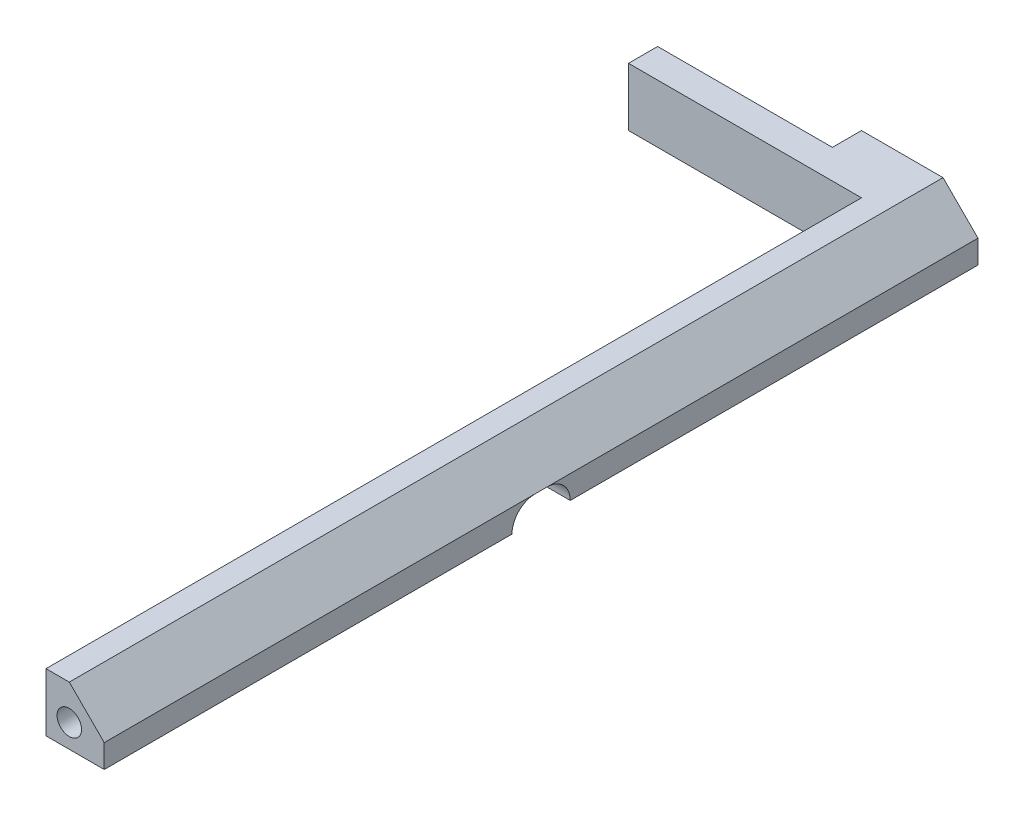
ISO-10303-21;
HEADER;
FILE_DESCRIPTION(('STEP AP214'),'2;1');
FILE_NAME('part.step','',(''),(''),'','','');
FILE_SCHEMA(('AUTOMOTIVE_DESIGN { 1 0 10303 214 1 1 1 1 }'));
ENDSEC;
DATA;
#1=APPLICATION_CONTEXT('core data for automotive mechanical design processes');
#2=APPLICATION_PROTOCOL_DEFINITION('international standard','automotive_design',2000,#1);
#3=PRODUCT_CONTEXT('',#1,'mechanical');
#4=PRODUCT('Part','Part','',(#3));
#5=PRODUCT_RELATED_PRODUCT_CATEGORY('part','',(#4));
#6=PRODUCT_DEFINITION_FORMATION('','',#4);
#7=PRODUCT_DEFINITION_CONTEXT('part definition',#1,'design');
#8=PRODUCT_DEFINITION('design','',#6,#7);
#9=PRODUCT_DEFINITION_SHAPE('','',#8);
#10=(LENGTH_UNIT() NAMED_UNIT(*) SI_UNIT(.MILLI.,.METRE.));
#11=(NAMED_UNIT(*) PLANE_ANGLE_UNIT() SI_UNIT($,.RADIAN.));
#12=(NAMED_UNIT(*) SI_UNIT($,.STERADIAN.) SOLID_ANGLE_UNIT());
#13=UNCERTAINTY_MEASURE_WITH_UNIT(LENGTH_MEASURE(1.E-05),#10,'distance_accuracy_value','');
#14=(GEOMETRIC_REPRESENTATION_CONTEXT(3) GLOBAL_UNCERTAINTY_ASSIGNED_CONTEXT((#13)) GLOBAL_UNIT_ASSIGNED_CONTEXT((#10,
#11,#12)) REPRESENTATION_CONTEXT('',''));
#15=CARTESIAN_POINT('',(0.,0.,0.));
#16=DIRECTION('',(0.,0.,1.));
#17=DIRECTION('',(1.,0.,0.));
#18=AXIS2_PLACEMENT_3D('',#15,#16,#17);
#19=CARTESIAN_POINT('',(0.,10.,0.));
#20=DIRECTION('',(-1.,0.,0.));
#21=DIRECTION('',(0.,0.,1.));
#22=AXIS2_PLACEMENT_3D('',#19,#20,#21);
#23=PLANE('',#22);
#24=DIRECTION('',(0.,0.,-1.));
#25=VECTOR('',#24,1.);
#26=CARTESIAN_POINT('',(0.,0.,0.));
#27=LINE('',#26,#25);
#28=CARTESIAN_POINT('',(0.,0.,0.));
#29=VERTEX_POINT('',#28);
#30=CARTESIAN_POINT('',(0.,0.,-70.));
#31=VERTEX_POINT('',#30);
#32=EDGE_CURVE('E226',#29,#31,#27,.T.);
#33=ORIENTED_EDGE('',*,*,#32,.T.);
#34=CARTESIAN_POINT('',(0.,0.,-74.));
#35=DIRECTION('',(-1.,0.,0.));
#36=DIRECTION('',(0.,0.,1.));
#37=AXIS2_PLACEMENT_3D('',#34,#35,#36);
#38=CIRCLE('',#37,4.);
#39=CARTESIAN_POINT('',(0.,4.,-74.));
#40=VERTEX_POINT('',#39);
#41=EDGE_CURVE('E11',#31,#40,#38,.T.);
#42=ORIENTED_EDGE('',*,*,#41,.T.);
#43=DIRECTION('',(0.,0.,1.));
#44=VECTOR('',#43,1.);
#45=CARTESIAN_POINT('',(0.,3.99999999999998,0.));
#46=LINE('',#45,#44);
#47=CARTESIAN_POINT('',(0.,3.99999999999998,0.));
#48=VERTEX_POINT('',#47);
#49=EDGE_CURVE('E59',#40,#48,#46,.T.);
#50=ORIENTED_EDGE('',*,*,#49,.T.);
#51=DIRECTION('',(0.,-1.,0.));
#52=VECTOR('',#51,1.);
#53=CARTESIAN_POINT('',(0.,10.,0.));
#54=LINE('',#53,#52);
#55=EDGE_CURVE('E271',#48,#29,#54,.T.);
#56=ORIENTED_EDGE('',*,*,#55,.T.);
#57=EDGE_LOOP('',(#33,#42,#50,#56));
#58=FACE_BOUND('',#57,.T.);
#59=ADVANCED_FACE('F43',(#58),#23,.F.);
#60=CARTESIAN_POINT('',(0.,0.,0.));
#61=DIRECTION('',(0.,1.,0.));
#62=DIRECTION('',(0.,0.,1.));
#63=AXIS2_PLACEMENT_3D('',#60,#61,#62);
#64=PLANE('',#63);
#65=CARTESIAN_POINT('',(-7.2,0.,-27.));
#66=DIRECTION('',(0.,-1.,0.));
#67=DIRECTION('',(0.,0.,-1.));
#68=AXIS2_PLACEMENT_3D('',#65,#66,#67);
#69=CIRCLE('',#68,2.1);
#70=CARTESIAN_POINT('',(-7.2,0.,-29.1));
#71=VERTEX_POINT('',#70);
#72=EDGE_CURVE('E180',#71,#71,#69,.T.);
#73=ORIENTED_EDGE('',*,*,#72,.F.);
#74=EDGE_LOOP('',(#73));
#75=FACE_BOUND('',#74,.T.);
#76=DIRECTION('',(0.,0.,1.));
#77=VECTOR('',#76,1.);
#78=CARTESIAN_POINT('',(-10.,0.,-140.));
#79=LINE('',#78,#77);
#80=CARTESIAN_POINT('',(-10.,0.,-70.));
#81=VERTEX_POINT('',#80);
#82=CARTESIAN_POINT('',(-10.,0.,0.));
#83=VERTEX_POINT('',#82);
#84=EDGE_CURVE('E143',#81,#83,#79,.T.);
#85=ORIENTED_EDGE('',*,*,#84,.F.);
#86=DIRECTION('',(-1.,0.,0.));
#87=VECTOR('',#86,1.);
#88=CARTESIAN_POINT('',(0.,0.,-70.));
#89=LINE('',#88,#87);
#90=EDGE_CURVE('E157',#31,#81,#89,.T.);
#91=ORIENTED_EDGE('',*,*,#90,.F.);
#92=ORIENTED_EDGE('',*,*,#32,.F.);
#93=DIRECTION('',(1.,0.,0.));
#94=VECTOR('',#93,1.);
#95=CARTESIAN_POINT('',(-10.,0.,0.));
#96=LINE('',#95,#94);
#97=EDGE_CURVE('E160',#83,#29,#96,.T.);
#98=ORIENTED_EDGE('',*,*,#97,.F.);
#99=EDGE_LOOP('',(#85,#91,#92,#98));
#100=FACE_BOUND('',#99,.T.);
#101=ADVANCED_FACE('F155',(#75,#100),#64,.F.);
#102=CARTESIAN_POINT('',(-10.,10.,0.));
#103=DIRECTION('',(0.,0.,-1.));
#104=DIRECTION('',(-1.,0.,0.));
#105=AXIS2_PLACEMENT_3D('',#102,#103,#104);
#106=PLANE('',#105);
#107=CARTESIAN_POINT('',(-6.,4.,0.));
#108=DIRECTION('',(0.,0.,1.));
#109=DIRECTION('',(1.,0.,0.));
#110=AXIS2_PLACEMENT_3D('',#107,#108,#109);
#111=CIRCLE('',#110,2.1);
#112=CARTESIAN_POINT('',(-3.9,4.,0.));
#113=VERTEX_POINT('',#112);
#114=EDGE_CURVE('E181',#113,#113,#111,.T.);
#115=ORIENTED_EDGE('',*,*,#114,.F.);
#116=EDGE_LOOP('',(#115));
#117=FACE_BOUND('',#116,.T.);
#118=ORIENTED_EDGE('',*,*,#55,.F.);
#119=DIRECTION('',(-0.707106781186546,0.707106781186549,0.));
#120=VECTOR('',#119,1.);
#121=CARTESIAN_POINT('',(-5.99999999999999,10.,0.));
#122=LINE('',#121,#120);
#123=CARTESIAN_POINT('',(-5.99999999999999,10.,0.));
#124=VERTEX_POINT('',#123);
#125=EDGE_CURVE('E283',#48,#124,#122,.T.);
#126=ORIENTED_EDGE('',*,*,#125,.T.);
#127=DIRECTION('',(1.,0.,0.));
#128=VECTOR('',#127,1.);
#129=CARTESIAN_POINT('',(-10.,10.,0.));
#130=LINE('',#129,#128);
#131=CARTESIAN_POINT('',(-10.,10.,0.));
#132=VERTEX_POINT('',#131);
#133=EDGE_CURVE('E200',#132,#124,#130,.T.);
#134=ORIENTED_EDGE('',*,*,#133,.F.);
#135=DIRECTION('',(0.,-1.,0.));
#136=VECTOR('',#135,1.);
#137=CARTESIAN_POINT('',(-10.,10.,0.));
#138=LINE('',#137,#136);
#139=EDGE_CURVE('E222',#132,#83,#138,.T.);
#140=ORIENTED_EDGE('',*,*,#139,.T.);
#141=ORIENTED_EDGE('',*,*,#97,.T.);
#142=EDGE_LOOP('',(#118,#126,#134,#140,#141));
#143=FACE_BOUND('',#142,.T.);
#144=ADVANCED_FACE('F316',(#117,#143),#106,.F.);
#145=CARTESIAN_POINT('',(0.,3.99999999999998,-150.));
#146=VERTEX_POINT('',#145);
#147=CARTESIAN_POINT('',(0.,3.99999999999998,-76.));
#148=VERTEX_POINT('',#147);
#149=EDGE_CURVE('E67',#146,#148,#46,.T.);
#150=ORIENTED_EDGE('',*,*,#149,.T.);
#151=CARTESIAN_POINT('',(0.,0.,-76.));
#152=DIRECTION('',(-1.,0.,0.));
#153=DIRECTION('',(0.,0.,1.));
#154=AXIS2_PLACEMENT_3D('',#151,#152,#153);
#155=CIRCLE('',#154,4.);
#156=CARTESIAN_POINT('',(0.,0.,-80.));
#157=VERTEX_POINT('',#156);
#158=EDGE_CURVE('E293',#148,#157,#155,.T.);
#159=ORIENTED_EDGE('',*,*,#158,.T.);
#160=CARTESIAN_POINT('',(0.,0.,-150.));
#161=VERTEX_POINT('',#160);
#162=EDGE_CURVE('E225',#157,#161,#27,.T.);
#163=ORIENTED_EDGE('',*,*,#162,.T.);
#164=DIRECTION('',(0.,-1.,0.));
#165=VECTOR('',#164,1.);
#166=CARTESIAN_POINT('',(0.,10.,-150.));
#167=LINE('',#166,#165);
#168=EDGE_CURVE('E267',#146,#161,#167,.T.);
#169=ORIENTED_EDGE('',*,*,#168,.F.);
#170=EDGE_LOOP('',(#150,#159,#163,#169));
#171=FACE_BOUND('',#170,.T.);
#172=ADVANCED_FACE('F306',(#171),#23,.F.);
#173=CARTESIAN_POINT('',(0.,10.,-150.));
#174=DIRECTION('',(0.,0.,1.));
#175=DIRECTION('',(1.,0.,0.));
#176=AXIS2_PLACEMENT_3D('',#173,#174,#175);
#177=PLANE('',#176);
#178=DIRECTION('',(-1.,0.,0.));
#179=VECTOR('',#178,1.);
#180=CARTESIAN_POINT('',(0.,10.,-150.));
#181=LINE('',#180,#179);
#182=CARTESIAN_POINT('',(-5.99999999999999,10.,-150.));
#183=VERTEX_POINT('',#182);
#184=CARTESIAN_POINT('',(-20.,10.,-150.));
#185=VERTEX_POINT('',#184);
#186=EDGE_CURVE('E204',#183,#185,#181,.T.);
#187=ORIENTED_EDGE('',*,*,#186,.F.);
#188=DIRECTION('',(0.707106781186546,-0.707106781186549,0.));
#189=VECTOR('',#188,1.);
#190=CARTESIAN_POINT('',(-5.99999999999999,10.,-150.));
#191=LINE('',#190,#189);
#192=EDGE_CURVE('E278',#183,#146,#191,.T.);
#193=ORIENTED_EDGE('',*,*,#192,.T.);
#194=ORIENTED_EDGE('',*,*,#168,.T.);
#195=DIRECTION('',(-1.,0.,0.));
#196=VECTOR('',#195,1.);
#197=CARTESIAN_POINT('',(0.,0.,-150.));
#198=LINE('',#197,#196);
#199=CARTESIAN_POINT('',(-20.,0.,-150.));
#200=VERTEX_POINT('',#199);
#201=EDGE_CURVE('E229',#161,#200,#198,.T.);
#202=ORIENTED_EDGE('',*,*,#201,.T.);
#203=DIRECTION('',(0.,-1.,0.));
#204=VECTOR('',#203,1.);
#205=CARTESIAN_POINT('',(-20.,10.,-150.));
#206=LINE('',#205,#204);
#207=EDGE_CURVE('E263',#185,#200,#206,.T.);
#208=ORIENTED_EDGE('',*,*,#207,.F.);
#209=EDGE_LOOP('',(#187,#193,#194,#202,#208));
#210=FACE_BOUND('',#209,.T.);
#211=ADVANCED_FACE('F344',(#210),#177,.F.);
#212=CARTESIAN_POINT('',(-20.,10.,-150.));
#213=DIRECTION('',(1.,0.,0.));
#214=DIRECTION('',(0.,0.,-1.));
#215=AXIS2_PLACEMENT_3D('',#212,#213,#214);
#216=PLANE('',#215);
#217=DIRECTION('',(0.,0.,1.));
#218=VECTOR('',#217,1.);
#219=CARTESIAN_POINT('',(-20.,0.,-150.));
#220=LINE('',#219,#218);
#221=CARTESIAN_POINT('',(-20.,0.,-145.));
#222=VERTEX_POINT('',#221);
#223=EDGE_CURVE('E232',#200,#222,#220,.T.);
#224=ORIENTED_EDGE('',*,*,#223,.T.);
#225=DIRECTION('',(0.,-1.,0.));
#226=VECTOR('',#225,1.);
#227=CARTESIAN_POINT('',(-20.,10.,-145.));
#228=LINE('',#227,#226);
#229=CARTESIAN_POINT('',(-20.,10.,-145.));
#230=VERTEX_POINT('',#229);
#231=EDGE_CURVE('E259',#230,#222,#228,.T.);
#232=ORIENTED_EDGE('',*,*,#231,.F.);
#233=DIRECTION('',(0.,0.,1.));
#234=VECTOR('',#233,1.);
#235=CARTESIAN_POINT('',(-20.,10.,-150.));
#236=LINE('',#235,#234);
#237=EDGE_CURVE('E207',#185,#230,#236,.T.);
#238=ORIENTED_EDGE('',*,*,#237,.F.);
#239=ORIENTED_EDGE('',*,*,#207,.T.);
#240=EDGE_LOOP('',(#224,#232,#238,#239));
#241=FACE_BOUND('',#240,.T.);
#242=ADVANCED_FACE('F340',(#241),#216,.F.);
#243=CARTESIAN_POINT('',(-50.,10.,-145.));
#244=DIRECTION('',(0.,0.,1.));
#245=DIRECTION('',(1.,0.,0.));
#246=AXIS2_PLACEMENT_3D('',#243,#244,#245);
#247=PLANE('',#246);
#248=DIRECTION('',(-1.,0.,0.));
#249=VECTOR('',#248,1.);
#250=CARTESIAN_POINT('',(-50.,0.,-145.));
#251=LINE('',#250,#249);
#252=CARTESIAN_POINT('',(-50.,0.,-145.));
#253=VERTEX_POINT('',#252);
#254=EDGE_CURVE('E235',#222,#253,#251,.T.);
#255=ORIENTED_EDGE('',*,*,#254,.T.);
#256=DIRECTION('',(0.,-1.,0.));
#257=VECTOR('',#256,1.);
#258=CARTESIAN_POINT('',(-50.,10.,-145.));
#259=LINE('',#258,#257);
#260=CARTESIAN_POINT('',(-50.,10.,-145.));
#261=VERTEX_POINT('',#260);
#262=EDGE_CURVE('E255',#261,#253,#259,.T.);
#263=ORIENTED_EDGE('',*,*,#262,.F.);
#264=DIRECTION('',(-1.,0.,0.));
#265=VECTOR('',#264,1.);
#266=CARTESIAN_POINT('',(-50.,10.,-145.));
#267=LINE('',#266,#265);
#268=EDGE_CURVE('E210',#230,#261,#267,.T.);
#269=ORIENTED_EDGE('',*,*,#268,.F.);
#270=ORIENTED_EDGE('',*,*,#231,.T.);
#271=EDGE_LOOP('',(#255,#263,#269,#270));
#272=FACE_BOUND('',#271,.T.);
#273=ADVANCED_FACE('F336',(#272),#247,.F.);
#274=CARTESIAN_POINT('',(-50.,10.,-140.));
#275=DIRECTION('',(1.,0.,0.));
#276=DIRECTION('',(0.,0.,-1.));
#277=AXIS2_PLACEMENT_3D('',#274,#275,#276);
#278=PLANE('',#277);
#279=DIRECTION('',(0.,0.,1.));
#280=VECTOR('',#279,1.);
#281=CARTESIAN_POINT('',(-50.,0.,-140.));
#282=LINE('',#281,#280);
#283=CARTESIAN_POINT('',(-50.,0.,-140.));
#284=VERTEX_POINT('',#283);
#285=EDGE_CURVE('E238',#253,#284,#282,.T.);
#286=ORIENTED_EDGE('',*,*,#285,.T.);
#287=DIRECTION('',(0.,-1.,0.));
#288=VECTOR('',#287,1.);
#289=CARTESIAN_POINT('',(-50.,10.,-140.));
#290=LINE('',#289,#288);
#291=CARTESIAN_POINT('',(-50.,10.,-140.));
#292=VERTEX_POINT('',#291);
#293=EDGE_CURVE('E251',#292,#284,#290,.T.);
#294=ORIENTED_EDGE('',*,*,#293,.F.);
#295=DIRECTION('',(0.,0.,1.));
#296=VECTOR('',#295,1.);
#297=CARTESIAN_POINT('',(-50.,10.,-140.));
#298=LINE('',#297,#296);
#299=EDGE_CURVE('E213',#261,#292,#298,.T.);
#300=ORIENTED_EDGE('',*,*,#299,.F.);
#301=ORIENTED_EDGE('',*,*,#262,.T.);
#302=EDGE_LOOP('',(#286,#294,#300,#301));
#303=FACE_BOUND('',#302,.T.);
#304=ADVANCED_FACE('F332',(#303),#278,.F.);
#305=CARTESIAN_POINT('',(-50.,10.,-140.));
#306=DIRECTION('',(0.,0.,-1.));
#307=DIRECTION('',(-1.,0.,0.));
#308=AXIS2_PLACEMENT_3D('',#305,#306,#307);
#309=PLANE('',#308);
#310=DIRECTION('',(1.,0.,0.));
#311=VECTOR('',#310,1.);
#312=CARTESIAN_POINT('',(-50.,0.,-140.));
#313=LINE('',#312,#311);
#314=CARTESIAN_POINT('',(-10.,0.,-140.));
#315=VERTEX_POINT('',#314);
#316=EDGE_CURVE('E163',#284,#315,#313,.T.);
#317=ORIENTED_EDGE('',*,*,#316,.T.);
#318=DIRECTION('',(0.,-1.,0.));
#319=VECTOR('',#318,1.);
#320=CARTESIAN_POINT('',(-10.,10.,-140.));
#321=LINE('',#320,#319);
#322=CARTESIAN_POINT('',(-10.,10.,-140.));
#323=VERTEX_POINT('',#322);
#324=EDGE_CURVE('E247',#323,#315,#321,.T.);
#325=ORIENTED_EDGE('',*,*,#324,.F.);
#326=DIRECTION('',(1.,0.,0.));
#327=VECTOR('',#326,1.);
#328=CARTESIAN_POINT('',(-50.,10.,-140.));
#329=LINE('',#328,#327);
#330=EDGE_CURVE('E216',#292,#323,#329,.T.);
#331=ORIENTED_EDGE('',*,*,#330,.F.);
#332=ORIENTED_EDGE('',*,*,#293,.T.);
#333=EDGE_LOOP('',(#317,#325,#331,#332));
#334=FACE_BOUND('',#333,.T.);
#335=ADVANCED_FACE('F327',(#334),#309,.F.);
#336=CARTESIAN_POINT('',(-10.,10.,-140.));
#337=DIRECTION('',(1.,0.,0.));
#338=DIRECTION('',(0.,0.,-1.));
#339=AXIS2_PLACEMENT_3D('',#336,#337,#338);
#340=PLANE('',#339);
#341=DIRECTION('',(0.,0.,-1.));
#342=VECTOR('',#341,1.);
#343=CARTESIAN_POINT('',(-10.,4.,-70.));
#344=LINE('',#343,#342);
#345=CARTESIAN_POINT('',(-10.,4.,-74.));
#346=VERTEX_POINT('',#345);
#347=CARTESIAN_POINT('',(-10.,4.,-76.));
#348=VERTEX_POINT('',#347);
#349=EDGE_CURVE('E146',#346,#348,#344,.T.);
#350=ORIENTED_EDGE('',*,*,#349,.F.);
#351=CARTESIAN_POINT('',(-10.,0.,-74.));
#352=DIRECTION('',(1.,0.,0.));
#353=DIRECTION('',(0.,0.,-1.));
#354=AXIS2_PLACEMENT_3D('',#351,#352,#353);
#355=CIRCLE('',#354,4.);
#356=EDGE_CURVE('E52',#346,#81,#355,.T.);
#357=ORIENTED_EDGE('',*,*,#356,.T.);
#358=ORIENTED_EDGE('',*,*,#84,.T.);
#359=ORIENTED_EDGE('',*,*,#139,.F.);
#360=DIRECTION('',(0.,0.,1.));
#361=VECTOR('',#360,1.);
#362=CARTESIAN_POINT('',(-10.,10.,-140.));
#363=LINE('',#362,#361);
#364=EDGE_CURVE('E219',#323,#132,#363,.T.);
#365=ORIENTED_EDGE('',*,*,#364,.F.);
#366=ORIENTED_EDGE('',*,*,#324,.T.);
#367=CARTESIAN_POINT('',(-10.,0.,-80.));
#368=VERTEX_POINT('',#367);
#369=EDGE_CURVE('E162',#315,#368,#79,.T.);
#370=ORIENTED_EDGE('',*,*,#369,.T.);
#371=CARTESIAN_POINT('',(-10.,0.,-76.));
#372=DIRECTION('',(1.,0.,0.));
#373=DIRECTION('',(0.,0.,-1.));
#374=AXIS2_PLACEMENT_3D('',#371,#372,#373);
#375=CIRCLE('',#374,4.);
#376=EDGE_CURVE('E152',#368,#348,#375,.T.);
#377=ORIENTED_EDGE('',*,*,#376,.T.);
#378=EDGE_LOOP('',(#350,#357,#358,#359,#365,#366,#370,#377));
#379=FACE_BOUND('',#378,.T.);
#380=ADVANCED_FACE('F141',(#379),#340,.F.);
#381=CARTESIAN_POINT('',(0.,10.,0.));
#382=DIRECTION('',(0.,1.,0.));
#383=DIRECTION('',(0.,0.,1.));
#384=AXIS2_PLACEMENT_3D('',#381,#382,#383);
#385=PLANE('',#384);
#386=ORIENTED_EDGE('',*,*,#133,.T.);
#387=DIRECTION('',(0.,0.,-1.));
#388=VECTOR('',#387,1.);
#389=CARTESIAN_POINT('',(-5.99999999999999,10.,-150.));
#390=LINE('',#389,#388);
#391=EDGE_CURVE('E274',#124,#183,#390,.T.);
#392=ORIENTED_EDGE('',*,*,#391,.T.);
#393=ORIENTED_EDGE('',*,*,#186,.T.);
#394=ORIENTED_EDGE('',*,*,#237,.T.);
#395=ORIENTED_EDGE('',*,*,#268,.T.);
#396=ORIENTED_EDGE('',*,*,#299,.T.);
#397=ORIENTED_EDGE('',*,*,#330,.T.);
#398=ORIENTED_EDGE('',*,*,#364,.T.);
#399=EDGE_LOOP('',(#386,#392,#393,#394,#395,#396,#397,#398));
#400=FACE_BOUND('',#399,.T.);
#401=ADVANCED_FACE('F321',(#400),#385,.T.);
#402=CARTESIAN_POINT('',(-7.19999999999998,0.,-123.));
#403=DIRECTION('',(0.,-1.,0.));
#404=DIRECTION('',(0.,0.,-1.));
#405=AXIS2_PLACEMENT_3D('',#402,#403,#404);
#406=CIRCLE('',#405,2.10000000000001);
#407=CARTESIAN_POINT('',(-7.19999999999998,0.,-125.1));
#408=VERTEX_POINT('',#407);
#409=EDGE_CURVE('E189',#408,#408,#406,.T.);
#410=ORIENTED_EDGE('',*,*,#409,.F.);
#411=EDGE_LOOP('',(#410));
#412=FACE_BOUND('',#411,.T.);
#413=ORIENTED_EDGE('',*,*,#162,.F.);
#414=DIRECTION('',(1.,0.,0.));
#415=VECTOR('',#414,1.);
#416=CARTESIAN_POINT('',(-10.,0.,-80.));
#417=LINE('',#416,#415);
#418=EDGE_CURVE('E167',#368,#157,#417,.T.);
#419=ORIENTED_EDGE('',*,*,#418,.F.);
#420=ORIENTED_EDGE('',*,*,#369,.F.);
#421=ORIENTED_EDGE('',*,*,#316,.F.);
#422=ORIENTED_EDGE('',*,*,#285,.F.);
#423=ORIENTED_EDGE('',*,*,#254,.F.);
#424=ORIENTED_EDGE('',*,*,#223,.F.);
#425=ORIENTED_EDGE('',*,*,#201,.F.);
#426=EDGE_LOOP('',(#413,#419,#420,#421,#422,#423,#424,#425));
#427=FACE_BOUND('',#426,.T.);
#428=ADVANCED_FACE('F309',(#412,#427),#64,.F.);
#429=CARTESIAN_POINT('',(-7.2,4.,-27.));
#430=DIRECTION('',(0.,-1.,0.));
#431=DIRECTION('',(0.,0.,-1.));
#432=AXIS2_PLACEMENT_3D('',#429,#430,#431);
#433=CYLINDRICAL_SURFACE('',#432,2.1);
#434=CARTESIAN_POINT('',(-7.2,4.,-27.));
#435=DIRECTION('',(0.,-1.,0.));
#436=DIRECTION('',(0.,0.,-1.));
#437=AXIS2_PLACEMENT_3D('',#434,#435,#436);
#438=CIRCLE('',#437,2.1);
#439=CARTESIAN_POINT('',(-7.2,4.,-29.1));
#440=VERTEX_POINT('',#439);
#441=EDGE_CURVE('E193',#440,#440,#438,.T.);
#442=ORIENTED_EDGE('',*,*,#441,.F.);
#443=EDGE_LOOP('',(#442));
#444=FACE_BOUND('',#443,.T.);
#445=ORIENTED_EDGE('',*,*,#72,.T.);
#446=EDGE_LOOP('',(#445));
#447=FACE_BOUND('',#446,.T.);
#448=ADVANCED_FACE('F395',(#444,#447),#433,.F.);
#449=CARTESIAN_POINT('',(-7.2,4.,-27.));
#450=DIRECTION('',(0.,-1.,0.));
#451=DIRECTION('',(0.,0.,-1.));
#452=AXIS2_PLACEMENT_3D('',#449,#450,#451);
#453=PLANE('',#452);
#454=ORIENTED_EDGE('',*,*,#441,.T.);
#455=EDGE_LOOP('',(#454));
#456=FACE_BOUND('',#455,.T.);
#457=ADVANCED_FACE('F391',(#456),#453,.T.);
#458=CARTESIAN_POINT('',(-7.19999999999998,4.,-123.));
#459=DIRECTION('',(0.,-1.,0.));
#460=DIRECTION('',(0.,0.,-1.));
#461=AXIS2_PLACEMENT_3D('',#458,#459,#460);
#462=CYLINDRICAL_SURFACE('',#461,2.10000000000001);
#463=CARTESIAN_POINT('',(-7.19999999999998,4.,-123.));
#464=DIRECTION('',(0.,-1.,0.));
#465=DIRECTION('',(0.,0.,-1.));
#466=AXIS2_PLACEMENT_3D('',#463,#464,#465);
#467=CIRCLE('',#466,2.10000000000001);
#468=CARTESIAN_POINT('',(-7.19999999999998,4.,-125.1));
#469=VERTEX_POINT('',#468);
#470=EDGE_CURVE('E185',#469,#469,#467,.T.);
#471=ORIENTED_EDGE('',*,*,#470,.F.);
#472=EDGE_LOOP('',(#471));
#473=FACE_BOUND('',#472,.T.);
#474=ORIENTED_EDGE('',*,*,#409,.T.);
#475=EDGE_LOOP('',(#474));
#476=FACE_BOUND('',#475,.T.);
#477=ADVANCED_FACE('F384',(#473,#476),#462,.F.);
#478=CARTESIAN_POINT('',(-7.19999999999998,4.,-123.));
#479=DIRECTION('',(0.,-1.,0.));
#480=DIRECTION('',(0.,0.,-1.));
#481=AXIS2_PLACEMENT_3D('',#478,#479,#480);
#482=PLANE('',#481);
#483=ORIENTED_EDGE('',*,*,#470,.T.);
#484=EDGE_LOOP('',(#483));
#485=FACE_BOUND('',#484,.T.);
#486=ADVANCED_FACE('F378',(#485),#482,.T.);
#487=CARTESIAN_POINT('',(-6.,4.,-4.));
#488=DIRECTION('',(0.,0.,1.));
#489=DIRECTION('',(1.,0.,0.));
#490=AXIS2_PLACEMENT_3D('',#487,#488,#489);
#491=CYLINDRICAL_SURFACE('',#490,2.1);
#492=CARTESIAN_POINT('',(-6.,4.,-4.));
#493=DIRECTION('',(0.,0.,1.));
#494=DIRECTION('',(1.,0.,0.));
#495=AXIS2_PLACEMENT_3D('',#492,#493,#494);
#496=CIRCLE('',#495,2.1);
#497=CARTESIAN_POINT('',(-3.9,4.,-4.));
#498=VERTEX_POINT('',#497);
#499=EDGE_CURVE('E176',#498,#498,#496,.T.);
#500=ORIENTED_EDGE('',*,*,#499,.F.);
#501=EDGE_LOOP('',(#500));
#502=FACE_BOUND('',#501,.T.);
#503=ORIENTED_EDGE('',*,*,#114,.T.);
#504=EDGE_LOOP('',(#503));
#505=FACE_BOUND('',#504,.T.);
#506=ADVANCED_FACE('F354',(#502,#505),#491,.F.);
#507=CARTESIAN_POINT('',(-6.,4.,-4.));
#508=DIRECTION('',(0.,0.,1.));
#509=DIRECTION('',(1.,0.,0.));
#510=AXIS2_PLACEMENT_3D('',#507,#508,#509);
#511=PLANE('',#510);
#512=ORIENTED_EDGE('',*,*,#499,.T.);
#513=EDGE_LOOP('',(#512));
#514=FACE_BOUND('',#513,.T.);
#515=ADVANCED_FACE('F347',(#514),#511,.T.);
#516=CARTESIAN_POINT('',(-5.99999999999999,10.,0.));
#517=DIRECTION('',(0.707106781186549,0.707106781186546,0.));
#518=DIRECTION('',(0.,0.,1.));
#519=AXIS2_PLACEMENT_3D('',#516,#517,#518);
#520=PLANE('',#519);
#521=ORIENTED_EDGE('',*,*,#125,.F.);
#522=ORIENTED_EDGE('',*,*,#49,.F.);
#523=DIRECTION('',(0.,0.,1.));
#524=VECTOR('',#523,1.);
#525=CARTESIAN_POINT('',(0.,4.,-80.));
#526=LINE('',#525,#524);
#527=EDGE_CURVE('E173',#148,#40,#526,.T.);
#528=ORIENTED_EDGE('',*,*,#527,.F.);
#529=ORIENTED_EDGE('',*,*,#149,.F.);
#530=ORIENTED_EDGE('',*,*,#192,.F.);
#531=ORIENTED_EDGE('',*,*,#391,.F.);
#532=EDGE_LOOP('',(#521,#522,#528,#529,#530,#531));
#533=FACE_BOUND('',#532,.T.);
#534=ADVANCED_FACE('F345',(#533),#520,.T.);
#535=CARTESIAN_POINT('',(0.,4.,0.));
#536=DIRECTION('',(0.,-1.,0.));
#537=DIRECTION('',(0.,0.,-1.));
#538=AXIS2_PLACEMENT_3D('',#535,#536,#537);
#539=PLANE('',#538);
#540=ORIENTED_EDGE('',*,*,#349,.T.);
#541=DIRECTION('',(1.,0.,0.));
#542=VECTOR('',#541,1.);
#543=CARTESIAN_POINT('',(0.,4.,-76.));
#544=LINE('',#543,#542);
#545=EDGE_CURVE('E289',#348,#148,#544,.T.);
#546=ORIENTED_EDGE('',*,*,#545,.T.);
#547=ORIENTED_EDGE('',*,*,#527,.T.);
#548=DIRECTION('',(-1.,0.,0.));
#549=VECTOR('',#548,1.);
#550=CARTESIAN_POINT('',(1.02695629777827E-13,4.,-74.));
#551=LINE('',#550,#549);
#552=EDGE_CURVE('E286',#40,#346,#551,.T.);
#553=ORIENTED_EDGE('',*,*,#552,.T.);
#554=EDGE_LOOP('',(#540,#546,#547,#553));
#555=FACE_BOUND('',#554,.T.);
#556=ADVANCED_FACE('F302',(#555),#539,.T.);
#557=CARTESIAN_POINT('',(0.,0.,-76.));
#558=DIRECTION('',(1.,0.,0.));
#559=DIRECTION('',(0.,0.,-1.));
#560=AXIS2_PLACEMENT_3D('',#557,#558,#559);
#561=CYLINDRICAL_SURFACE('',#560,4.);
#562=ORIENTED_EDGE('',*,*,#376,.F.);
#563=ORIENTED_EDGE('',*,*,#418,.T.);
#564=ORIENTED_EDGE('',*,*,#158,.F.);
#565=ORIENTED_EDGE('',*,*,#545,.F.);
#566=EDGE_LOOP('',(#562,#563,#564,#565));
#567=FACE_BOUND('',#566,.T.);
#568=ADVANCED_FACE('F304',(#567),#561,.F.);
#569=CARTESIAN_POINT('',(1.02695629777827E-13,0.,-74.));
#570=DIRECTION('',(-1.,0.,0.));
#571=DIRECTION('',(0.,0.,1.));
#572=AXIS2_PLACEMENT_3D('',#569,#570,#571);
#573=CYLINDRICAL_SURFACE('',#572,4.);
#574=ORIENTED_EDGE('',*,*,#41,.F.);
#575=ORIENTED_EDGE('',*,*,#90,.T.);
#576=ORIENTED_EDGE('',*,*,#356,.F.);
#577=ORIENTED_EDGE('',*,*,#552,.F.);
#578=EDGE_LOOP('',(#574,#575,#576,#577));
#579=FACE_BOUND('',#578,.T.);
#580=ADVANCED_FACE('F45',(#579),#573,.F.);
#581=CLOSED_SHELL('',(#59,#101,#144,#172,#211,#242,#273,#304,#335,#380,#401,#428,#448,#457,#477,
#486,#506,#515,#534,#556,#568,#580));
#582=MANIFOLD_SOLID_BREP('B2',#581);
#583=ADVANCED_BREP_SHAPE_REPRESENTATION('',(#18,#582),#14);
#584=SHAPE_DEFINITION_REPRESENTATION(#9,#583);
ENDSEC;
END-ISO-10303-21;
